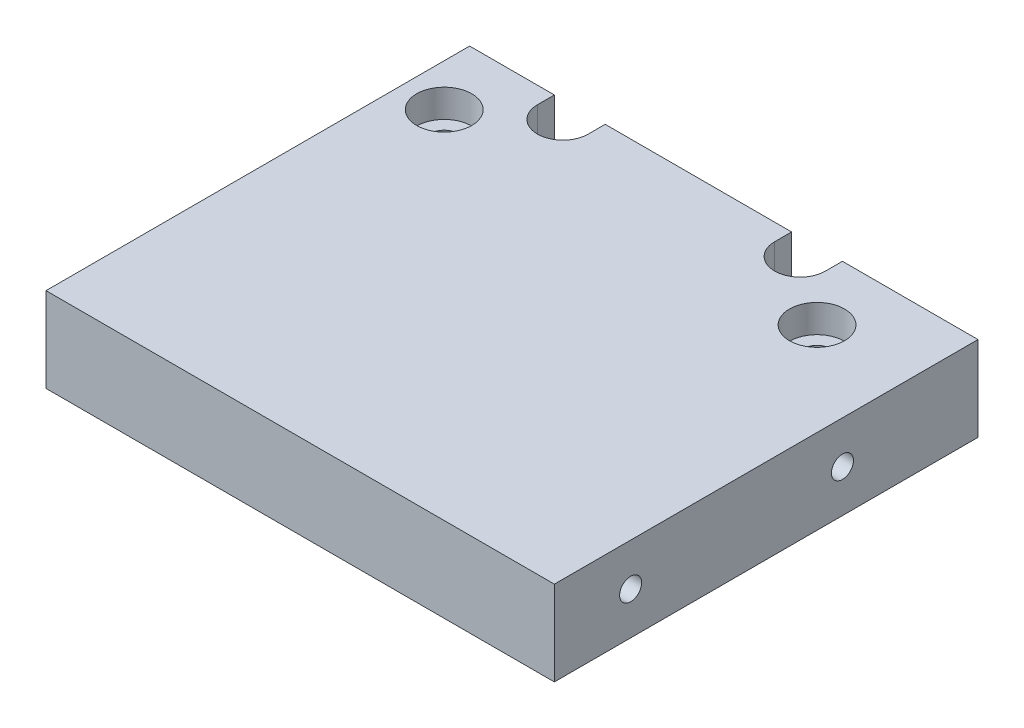
ISO-10303-21;
HEADER;
FILE_DESCRIPTION(('STEP AP214'),'2;1');
FILE_NAME('part.step','',(''),(''),'','','');
FILE_SCHEMA(('AUTOMOTIVE_DESIGN { 1 0 10303 214 1 1 1 1 }'));
ENDSEC;
DATA;
#1=APPLICATION_CONTEXT('core data for automotive mechanical design processes');
#2=APPLICATION_PROTOCOL_DEFINITION('international standard','automotive_design',2000,#1);
#3=PRODUCT_CONTEXT('',#1,'mechanical');
#4=PRODUCT('Part','Part','',(#3));
#5=PRODUCT_RELATED_PRODUCT_CATEGORY('part','',(#4));
#6=PRODUCT_DEFINITION_FORMATION('','',#4);
#7=PRODUCT_DEFINITION_CONTEXT('part definition',#1,'design');
#8=PRODUCT_DEFINITION('design','',#6,#7);
#9=PRODUCT_DEFINITION_SHAPE('','',#8);
#10=(LENGTH_UNIT() NAMED_UNIT(*) SI_UNIT(.MILLI.,.METRE.));
#11=(NAMED_UNIT(*) PLANE_ANGLE_UNIT() SI_UNIT($,.RADIAN.));
#12=(NAMED_UNIT(*) SI_UNIT($,.STERADIAN.) SOLID_ANGLE_UNIT());
#13=UNCERTAINTY_MEASURE_WITH_UNIT(LENGTH_MEASURE(1.E-05),#10,'distance_accuracy_value','');
#14=(GEOMETRIC_REPRESENTATION_CONTEXT(3) GLOBAL_UNCERTAINTY_ASSIGNED_CONTEXT((#13)) GLOBAL_UNIT_ASSIGNED_CONTEXT((#10,
#11,#12)) REPRESENTATION_CONTEXT('',''));
#15=CARTESIAN_POINT('',(0.,0.,0.));
#16=DIRECTION('',(0.,0.,1.));
#17=DIRECTION('',(1.,0.,0.));
#18=AXIS2_PLACEMENT_3D('',#15,#16,#17);
#19=CARTESIAN_POINT('',(0.,10.,0.));
#20=DIRECTION('',(0.,-1.,0.));
#21=DIRECTION('',(0.,0.,-1.));
#22=AXIS2_PLACEMENT_3D('',#19,#20,#21);
#23=PLANE('',#22);
#24=CARTESIAN_POINT('',(5.,10.,-42.));
#25=DIRECTION('',(0.,1.,0.));
#26=DIRECTION('',(0.,0.,1.));
#27=AXIS2_PLACEMENT_3D('',#24,#25,#26);
#28=CIRCLE('',#27,3.25);
#29=CARTESIAN_POINT('',(5.,10.,-38.75));
#30=VERTEX_POINT('',#29);
#31=EDGE_CURVE('E187',#30,#30,#28,.T.);
#32=ORIENTED_EDGE('',*,*,#31,.F.);
#33=EDGE_LOOP('',(#32));
#34=FACE_BOUND('',#33,.T.);
#35=DIRECTION('',(0.,0.,-1.));
#36=VECTOR('',#35,1.);
#37=CARTESIAN_POINT('',(60.,10.,0.));
#38=LINE('',#37,#36);
#39=CARTESIAN_POINT('',(60.,10.,0.));
#40=VERTEX_POINT('',#39);
#41=CARTESIAN_POINT('',(60.,10.,-50.));
#42=VERTEX_POINT('',#41);
#43=EDGE_CURVE('E274',#40,#42,#38,.T.);
#44=ORIENTED_EDGE('',*,*,#43,.T.);
#45=DIRECTION('',(1.,0.,0.));
#46=VECTOR('',#45,1.);
#47=CARTESIAN_POINT('',(0.,10.,-50.));
#48=LINE('',#47,#46);
#49=CARTESIAN_POINT('',(44.,10.,-50.));
#50=VERTEX_POINT('',#49);
#51=EDGE_CURVE('E269',#50,#42,#48,.T.);
#52=ORIENTED_EDGE('',*,*,#51,.F.);
#53=DIRECTION('',(0.,0.,-1.));
#54=VECTOR('',#53,1.);
#55=CARTESIAN_POINT('',(44.,10.,-48.));
#56=LINE('',#55,#54);
#57=CARTESIAN_POINT('',(44.,10.,-48.));
#58=VERTEX_POINT('',#57);
#59=EDGE_CURVE('E260',#58,#50,#56,.T.);
#60=ORIENTED_EDGE('',*,*,#59,.F.);
#61=CARTESIAN_POINT('',(41.,10.,-48.));
#62=DIRECTION('',(0.,1.,0.));
#63=DIRECTION('',(0.,0.,1.));
#64=AXIS2_PLACEMENT_3D('',#61,#62,#63);
#65=CIRCLE('',#64,3.);
#66=CARTESIAN_POINT('',(41.,10.,-45.));
#67=VERTEX_POINT('',#66);
#68=EDGE_CURVE('E263',#67,#58,#65,.T.);
#69=ORIENTED_EDGE('',*,*,#68,.F.);
#70=CARTESIAN_POINT('',(38.,10.,-48.));
#71=VERTEX_POINT('',#70);
#72=EDGE_CURVE('E264',#71,#67,#65,.T.);
#73=ORIENTED_EDGE('',*,*,#72,.F.);
#74=DIRECTION('',(0.,0.,1.));
#75=VECTOR('',#74,1.);
#76=CARTESIAN_POINT('',(38.,10.,-48.));
#77=LINE('',#76,#75);
#78=CARTESIAN_POINT('',(38.,10.,-50.));
#79=VERTEX_POINT('',#78);
#80=EDGE_CURVE('E252',#79,#71,#77,.T.);
#81=ORIENTED_EDGE('',*,*,#80,.F.);
#82=CARTESIAN_POINT('',(16.,10.,-50.));
#83=VERTEX_POINT('',#82);
#84=EDGE_CURVE('E275',#83,#79,#48,.T.);
#85=ORIENTED_EDGE('',*,*,#84,.F.);
#86=DIRECTION('',(0.,0.,-1.));
#87=VECTOR('',#86,1.);
#88=CARTESIAN_POINT('',(16.,10.,-48.));
#89=LINE('',#88,#87);
#90=CARTESIAN_POINT('',(16.,10.,-48.));
#91=VERTEX_POINT('',#90);
#92=EDGE_CURVE('E232',#91,#83,#89,.T.);
#93=ORIENTED_EDGE('',*,*,#92,.F.);
#94=CARTESIAN_POINT('',(13.,10.,-48.));
#95=DIRECTION('',(0.,1.,0.));
#96=DIRECTION('',(0.,0.,1.));
#97=AXIS2_PLACEMENT_3D('',#94,#95,#96);
#98=CIRCLE('',#97,2.99999999999999);
#99=CARTESIAN_POINT('',(13.,9.99999999999999,-45.));
#100=VERTEX_POINT('',#99);
#101=EDGE_CURVE('E233',#100,#91,#98,.T.);
#102=ORIENTED_EDGE('',*,*,#101,.F.);
#103=CARTESIAN_POINT('',(10.,10.,-48.));
#104=VERTEX_POINT('',#103);
#105=EDGE_CURVE('E229',#104,#100,#98,.T.);
#106=ORIENTED_EDGE('',*,*,#105,.F.);
#107=DIRECTION('',(0.,0.,1.));
#108=VECTOR('',#107,1.);
#109=CARTESIAN_POINT('',(10.,10.,-48.));
#110=LINE('',#109,#108);
#111=CARTESIAN_POINT('',(10.,10.,-49.9999999999998));
#112=VERTEX_POINT('',#111);
#113=EDGE_CURVE('E236',#112,#104,#110,.T.);
#114=ORIENTED_EDGE('',*,*,#113,.F.);
#115=CARTESIAN_POINT('',(0.,10.,-50.));
#116=VERTEX_POINT('',#115);
#117=EDGE_CURVE('E271',#116,#112,#48,.T.);
#118=ORIENTED_EDGE('',*,*,#117,.F.);
#119=DIRECTION('',(0.,0.,-1.));
#120=VECTOR('',#119,1.);
#121=CARTESIAN_POINT('',(0.,10.,0.));
#122=LINE('',#121,#120);
#123=CARTESIAN_POINT('',(0.,10.,0.));
#124=VERTEX_POINT('',#123);
#125=EDGE_CURVE('E267',#124,#116,#122,.T.);
#126=ORIENTED_EDGE('',*,*,#125,.F.);
#127=DIRECTION('',(1.,0.,0.));
#128=VECTOR('',#127,1.);
#129=CARTESIAN_POINT('',(0.,10.,0.));
#130=LINE('',#129,#128);
#131=EDGE_CURVE('E277',#124,#40,#130,.T.);
#132=ORIENTED_EDGE('',*,*,#131,.T.);
#133=EDGE_LOOP('',(#44,#52,#60,#69,#73,#81,#85,#93,#102,#106,#114,#118,#126,#132));
#134=FACE_BOUND('',#133,.T.);
#135=CARTESIAN_POINT('',(49.,10.,-42.));
#136=DIRECTION('',(0.,1.,0.));
#137=DIRECTION('',(0.,0.,1.));
#138=AXIS2_PLACEMENT_3D('',#135,#136,#137);
#139=CIRCLE('',#138,3.25);
#140=CARTESIAN_POINT('',(49.,10.,-38.75));
#141=VERTEX_POINT('',#140);
#142=EDGE_CURVE('E199',#141,#141,#139,.T.);
#143=ORIENTED_EDGE('',*,*,#142,.F.);
#144=EDGE_LOOP('',(#143));
#145=FACE_BOUND('',#144,.T.);
#146=ADVANCED_FACE('F47',(#34,#134,#145),#23,.F.);
#147=CARTESIAN_POINT('',(41.,0.,-48.));
#148=DIRECTION('',(0.,1.,0.));
#149=DIRECTION('',(0.,0.,1.));
#150=AXIS2_PLACEMENT_3D('',#147,#148,#149);
#151=CYLINDRICAL_SURFACE('',#150,3.);
#152=CARTESIAN_POINT('',(41.,7.,-48.));
#153=DIRECTION('',(0.,-0.707106781186548,0.707106781186547));
#154=DIRECTION('',(0.,0.707106781186547,0.707106781186548));
#155=AXIS2_PLACEMENT_3D('',#152,#153,#154);
#156=ELLIPSE('',#155,4.24264068711928,3.);
#157=CARTESIAN_POINT('',(44.,7.,-48.));
#158=VERTEX_POINT('',#157);
#159=EDGE_CURVE('E62',#67,#158,#156,.F.);
#160=ORIENTED_EDGE('',*,*,#159,.F.);
#161=ORIENTED_EDGE('',*,*,#68,.T.);
#162=DIRECTION('',(0.,1.,0.));
#163=VECTOR('',#162,1.);
#164=CARTESIAN_POINT('',(44.,0.,-48.));
#165=LINE('',#164,#163);
#166=EDGE_CURVE('E249',#158,#58,#165,.T.);
#167=ORIENTED_EDGE('',*,*,#166,.F.);
#168=EDGE_LOOP('',(#160,#161,#167));
#169=FACE_BOUND('',#168,.T.);
#170=ADVANCED_FACE('F349',(#169),#151,.F.);
#171=CARTESIAN_POINT('',(38.,7.,-48.));
#172=VERTEX_POINT('',#171);
#173=EDGE_CURVE('E226',#172,#67,#156,.F.);
#174=ORIENTED_EDGE('',*,*,#173,.F.);
#175=DIRECTION('',(0.,1.,0.));
#176=VECTOR('',#175,1.);
#177=CARTESIAN_POINT('',(38.,0.,-48.));
#178=LINE('',#177,#176);
#179=EDGE_CURVE('E228',#172,#71,#178,.T.);
#180=ORIENTED_EDGE('',*,*,#179,.T.);
#181=ORIENTED_EDGE('',*,*,#72,.T.);
#182=EDGE_LOOP('',(#174,#180,#181));
#183=FACE_BOUND('',#182,.T.);
#184=ADVANCED_FACE('F355',(#183),#151,.F.);
#185=CARTESIAN_POINT('',(38.,0.,-48.));
#186=DIRECTION('',(-1.,0.,0.));
#187=DIRECTION('',(0.,0.,1.));
#188=AXIS2_PLACEMENT_3D('',#185,#186,#187);
#189=PLANE('',#188);
#190=DIRECTION('',(0.,0.707106781186547,0.707106781186548));
#191=VECTOR('',#190,1.);
#192=CARTESIAN_POINT('',(38.,3.5,-51.5));
#193=LINE('',#192,#191);
#194=CARTESIAN_POINT('',(38.,5.,-50.));
#195=VERTEX_POINT('',#194);
#196=EDGE_CURVE('E70',#195,#172,#193,.T.);
#197=ORIENTED_EDGE('',*,*,#196,.F.);
#198=DIRECTION('',(0.,1.,0.));
#199=VECTOR('',#198,1.);
#200=CARTESIAN_POINT('',(38.,0.,-50.));
#201=LINE('',#200,#199);
#202=EDGE_CURVE('E255',#195,#79,#201,.T.);
#203=ORIENTED_EDGE('',*,*,#202,.T.);
#204=ORIENTED_EDGE('',*,*,#80,.T.);
#205=ORIENTED_EDGE('',*,*,#179,.F.);
#206=EDGE_LOOP('',(#197,#203,#204,#205));
#207=FACE_BOUND('',#206,.T.);
#208=ADVANCED_FACE('F360',(#207),#189,.F.);
#209=CARTESIAN_POINT('',(44.,0.,-48.));
#210=DIRECTION('',(1.,0.,0.));
#211=DIRECTION('',(0.,0.,-1.));
#212=AXIS2_PLACEMENT_3D('',#209,#210,#211);
#213=PLANE('',#212);
#214=DIRECTION('',(0.,-0.707106781186547,-0.707106781186548));
#215=VECTOR('',#214,1.);
#216=CARTESIAN_POINT('',(44.,3.5,-51.5));
#217=LINE('',#216,#215);
#218=CARTESIAN_POINT('',(44.,5.,-50.));
#219=VERTEX_POINT('',#218);
#220=EDGE_CURVE('E222',#158,#219,#217,.T.);
#221=ORIENTED_EDGE('',*,*,#220,.F.);
#222=ORIENTED_EDGE('',*,*,#166,.T.);
#223=ORIENTED_EDGE('',*,*,#59,.T.);
#224=DIRECTION('',(0.,1.,0.));
#225=VECTOR('',#224,1.);
#226=CARTESIAN_POINT('',(44.,0.,-50.));
#227=LINE('',#226,#225);
#228=EDGE_CURVE('E253',#219,#50,#227,.T.);
#229=ORIENTED_EDGE('',*,*,#228,.F.);
#230=EDGE_LOOP('',(#221,#222,#223,#229));
#231=FACE_BOUND('',#230,.T.);
#232=ADVANCED_FACE('F546',(#231),#213,.F.);
#233=CARTESIAN_POINT('',(13.,0.,-48.));
#234=DIRECTION('',(0.,1.,0.));
#235=DIRECTION('',(0.,0.,1.));
#236=AXIS2_PLACEMENT_3D('',#233,#234,#235);
#237=CYLINDRICAL_SURFACE('',#236,2.99999999999999);
#238=CARTESIAN_POINT('',(13.,7.,-48.));
#239=DIRECTION('',(0.,-0.707106781186548,0.707106781186547));
#240=DIRECTION('',(0.,0.707106781186547,0.707106781186548));
#241=AXIS2_PLACEMENT_3D('',#238,#239,#240);
#242=ELLIPSE('',#241,4.24264068711927,2.99999999999999);
#243=CARTESIAN_POINT('',(16.,7.00000000000005,-48.));
#244=VERTEX_POINT('',#243);
#245=EDGE_CURVE('E215',#100,#244,#242,.F.);
#246=ORIENTED_EDGE('',*,*,#245,.F.);
#247=ORIENTED_EDGE('',*,*,#101,.T.);
#248=DIRECTION('',(0.,1.,0.));
#249=VECTOR('',#248,1.);
#250=CARTESIAN_POINT('',(16.,0.,-48.));
#251=LINE('',#250,#249);
#252=EDGE_CURVE('E239',#244,#91,#251,.T.);
#253=ORIENTED_EDGE('',*,*,#252,.F.);
#254=EDGE_LOOP('',(#246,#247,#253));
#255=FACE_BOUND('',#254,.T.);
#256=ADVANCED_FACE('F332',(#255),#237,.F.);
#257=CARTESIAN_POINT('',(10.,7.,-48.));
#258=VERTEX_POINT('',#257);
#259=EDGE_CURVE('E218',#258,#100,#242,.F.);
#260=ORIENTED_EDGE('',*,*,#259,.F.);
#261=DIRECTION('',(0.,1.,0.));
#262=VECTOR('',#261,1.);
#263=CARTESIAN_POINT('',(10.,0.,-48.));
#264=LINE('',#263,#262);
#265=EDGE_CURVE('E240',#258,#104,#264,.T.);
#266=ORIENTED_EDGE('',*,*,#265,.T.);
#267=ORIENTED_EDGE('',*,*,#105,.T.);
#268=EDGE_LOOP('',(#260,#266,#267));
#269=FACE_BOUND('',#268,.T.);
#270=ADVANCED_FACE('F336',(#269),#237,.F.);
#271=CARTESIAN_POINT('',(10.,0.,-48.));
#272=DIRECTION('',(-1.,0.,0.));
#273=DIRECTION('',(0.,0.,1.));
#274=AXIS2_PLACEMENT_3D('',#271,#272,#273);
#275=PLANE('',#274);
#276=DIRECTION('',(0.,0.707106781186547,0.707106781186548));
#277=VECTOR('',#276,1.);
#278=CARTESIAN_POINT('',(10.,3.5,-51.5));
#279=LINE('',#278,#277);
#280=CARTESIAN_POINT('',(10.,5.00000000000022,-49.9999999999998));
#281=VERTEX_POINT('',#280);
#282=EDGE_CURVE('E219',#281,#258,#279,.T.);
#283=ORIENTED_EDGE('',*,*,#282,.F.);
#284=DIRECTION('',(0.,1.,0.));
#285=VECTOR('',#284,1.);
#286=CARTESIAN_POINT('',(10.,0.,-49.9999999999998));
#287=LINE('',#286,#285);
#288=EDGE_CURVE('E243',#281,#112,#287,.T.);
#289=ORIENTED_EDGE('',*,*,#288,.T.);
#290=ORIENTED_EDGE('',*,*,#113,.T.);
#291=ORIENTED_EDGE('',*,*,#265,.F.);
#292=EDGE_LOOP('',(#283,#289,#290,#291));
#293=FACE_BOUND('',#292,.T.);
#294=ADVANCED_FACE('F338',(#293),#275,.F.);
#295=CARTESIAN_POINT('',(16.,0.,-48.));
#296=DIRECTION('',(1.,0.,0.));
#297=DIRECTION('',(0.,0.,-1.));
#298=AXIS2_PLACEMENT_3D('',#295,#296,#297);
#299=PLANE('',#298);
#300=DIRECTION('',(0.,-0.707106781186547,-0.707106781186548));
#301=VECTOR('',#300,1.);
#302=CARTESIAN_POINT('',(16.,3.50000000000003,-51.5));
#303=LINE('',#302,#301);
#304=CARTESIAN_POINT('',(16.,5.,-50.));
#305=VERTEX_POINT('',#304);
#306=EDGE_CURVE('E11',#244,#305,#303,.T.);
#307=ORIENTED_EDGE('',*,*,#306,.F.);
#308=ORIENTED_EDGE('',*,*,#252,.T.);
#309=ORIENTED_EDGE('',*,*,#92,.T.);
#310=DIRECTION('',(0.,1.,0.));
#311=VECTOR('',#310,1.);
#312=CARTESIAN_POINT('',(16.,0.,-50.));
#313=LINE('',#312,#311);
#314=EDGE_CURVE('E245',#305,#83,#313,.T.);
#315=ORIENTED_EDGE('',*,*,#314,.F.);
#316=EDGE_LOOP('',(#307,#308,#309,#315));
#317=FACE_BOUND('',#316,.T.);
#318=ADVANCED_FACE('F329',(#317),#299,.F.);
#319=CARTESIAN_POINT('',(0.,10.,0.));
#320=DIRECTION('',(-1.,0.,0.));
#321=DIRECTION('',(0.,0.,1.));
#322=AXIS2_PLACEMENT_3D('',#319,#320,#321);
#323=PLANE('',#322);
#324=CARTESIAN_POINT('',(0.,5.,-34.));
#325=DIRECTION('',(-1.,0.,0.));
#326=DIRECTION('',(0.,0.,1.));
#327=AXIS2_PLACEMENT_3D('',#324,#325,#326);
#328=CIRCLE('',#327,1.3);
#329=CARTESIAN_POINT('',(0.,5.,-32.7));
#330=VERTEX_POINT('',#329);
#331=EDGE_CURVE('E165',#330,#330,#328,.T.);
#332=ORIENTED_EDGE('',*,*,#331,.F.);
#333=EDGE_LOOP('',(#332));
#334=FACE_BOUND('',#333,.T.);
#335=CARTESIAN_POINT('',(0.,5.,-9.));
#336=DIRECTION('',(-1.,0.,0.));
#337=DIRECTION('',(0.,0.,1.));
#338=AXIS2_PLACEMENT_3D('',#335,#336,#337);
#339=CIRCLE('',#338,1.3);
#340=CARTESIAN_POINT('',(0.,5.,-7.7));
#341=VERTEX_POINT('',#340);
#342=EDGE_CURVE('E164',#341,#341,#339,.T.);
#343=ORIENTED_EDGE('',*,*,#342,.F.);
#344=EDGE_LOOP('',(#343));
#345=FACE_BOUND('',#344,.T.);
#346=DIRECTION('',(0.,-1.,0.));
#347=VECTOR('',#346,1.);
#348=CARTESIAN_POINT('',(0.,10.,-50.));
#349=LINE('',#348,#347);
#350=CARTESIAN_POINT('',(0.,0.,-50.));
#351=VERTEX_POINT('',#350);
#352=EDGE_CURVE('E279',#116,#351,#349,.T.);
#353=ORIENTED_EDGE('',*,*,#352,.T.);
#354=DIRECTION('',(0.,0.,-1.));
#355=VECTOR('',#354,1.);
#356=CARTESIAN_POINT('',(0.,0.,0.));
#357=LINE('',#356,#355);
#358=CARTESIAN_POINT('',(0.,0.,0.));
#359=VERTEX_POINT('',#358);
#360=EDGE_CURVE('E242',#359,#351,#357,.T.);
#361=ORIENTED_EDGE('',*,*,#360,.F.);
#362=DIRECTION('',(0.,-1.,0.));
#363=VECTOR('',#362,1.);
#364=CARTESIAN_POINT('',(0.,10.,0.));
#365=LINE('',#364,#363);
#366=EDGE_CURVE('E55',#124,#359,#365,.T.);
#367=ORIENTED_EDGE('',*,*,#366,.F.);
#368=ORIENTED_EDGE('',*,*,#125,.T.);
#369=EDGE_LOOP('',(#353,#361,#367,#368));
#370=FACE_BOUND('',#369,.T.);
#371=ADVANCED_FACE('F49',(#334,#345,#370),#323,.T.);
#372=CARTESIAN_POINT('',(0.,10.,0.));
#373=DIRECTION('',(0.,0.,-1.));
#374=DIRECTION('',(-1.,0.,0.));
#375=AXIS2_PLACEMENT_3D('',#372,#373,#374);
#376=PLANE('',#375);
#377=DIRECTION('',(1.,0.,0.));
#378=VECTOR('',#377,1.);
#379=CARTESIAN_POINT('',(0.,0.,0.));
#380=LINE('',#379,#378);
#381=CARTESIAN_POINT('',(60.,0.,0.));
#382=VERTEX_POINT('',#381);
#383=EDGE_CURVE('E270',#359,#382,#380,.T.);
#384=ORIENTED_EDGE('',*,*,#383,.T.);
#385=DIRECTION('',(0.,-1.,0.));
#386=VECTOR('',#385,1.);
#387=CARTESIAN_POINT('',(60.,10.,0.));
#388=LINE('',#387,#386);
#389=EDGE_CURVE('E290',#40,#382,#388,.T.);
#390=ORIENTED_EDGE('',*,*,#389,.F.);
#391=ORIENTED_EDGE('',*,*,#131,.F.);
#392=ORIENTED_EDGE('',*,*,#366,.T.);
#393=EDGE_LOOP('',(#384,#390,#391,#392));
#394=FACE_BOUND('',#393,.T.);
#395=ADVANCED_FACE('F316',(#394),#376,.F.);
#396=CARTESIAN_POINT('',(60.,10.,0.));
#397=DIRECTION('',(-1.,0.,0.));
#398=DIRECTION('',(0.,0.,1.));
#399=AXIS2_PLACEMENT_3D('',#396,#397,#398);
#400=PLANE('',#399);
#401=CARTESIAN_POINT('',(60.,5.,-34.));
#402=DIRECTION('',(1.,0.,0.));
#403=DIRECTION('',(0.,0.,-1.));
#404=AXIS2_PLACEMENT_3D('',#401,#402,#403);
#405=CIRCLE('',#404,1.3);
#406=CARTESIAN_POINT('',(60.,5.,-35.3));
#407=VERTEX_POINT('',#406);
#408=EDGE_CURVE('E175',#407,#407,#405,.T.);
#409=ORIENTED_EDGE('',*,*,#408,.F.);
#410=EDGE_LOOP('',(#409));
#411=FACE_BOUND('',#410,.T.);
#412=CARTESIAN_POINT('',(60.,5.,-9.));
#413=DIRECTION('',(1.,0.,0.));
#414=DIRECTION('',(0.,0.,-1.));
#415=AXIS2_PLACEMENT_3D('',#412,#413,#414);
#416=CIRCLE('',#415,1.3);
#417=CARTESIAN_POINT('',(60.,5.,-10.3));
#418=VERTEX_POINT('',#417);
#419=EDGE_CURVE('E181',#418,#418,#416,.T.);
#420=ORIENTED_EDGE('',*,*,#419,.F.);
#421=EDGE_LOOP('',(#420));
#422=FACE_BOUND('',#421,.T.);
#423=DIRECTION('',(0.,0.,-1.));
#424=VECTOR('',#423,1.);
#425=CARTESIAN_POINT('',(60.,0.,0.));
#426=LINE('',#425,#424);
#427=CARTESIAN_POINT('',(60.,0.,-50.));
#428=VERTEX_POINT('',#427);
#429=EDGE_CURVE('E285',#382,#428,#426,.T.);
#430=ORIENTED_EDGE('',*,*,#429,.T.);
#431=DIRECTION('',(0.,-1.,0.));
#432=VECTOR('',#431,1.);
#433=CARTESIAN_POINT('',(60.,10.,-50.));
#434=LINE('',#433,#432);
#435=EDGE_CURVE('E293',#42,#428,#434,.T.);
#436=ORIENTED_EDGE('',*,*,#435,.F.);
#437=ORIENTED_EDGE('',*,*,#43,.F.);
#438=ORIENTED_EDGE('',*,*,#389,.T.);
#439=EDGE_LOOP('',(#430,#436,#437,#438));
#440=FACE_BOUND('',#439,.T.);
#441=ADVANCED_FACE('F312',(#411,#422,#440),#400,.F.);
#442=CARTESIAN_POINT('',(0.,10.,-50.));
#443=DIRECTION('',(0.,0.,-1.));
#444=DIRECTION('',(-1.,0.,0.));
#445=AXIS2_PLACEMENT_3D('',#442,#443,#444);
#446=PLANE('',#445);
#447=DIRECTION('',(-1.,0.,0.));
#448=VECTOR('',#447,1.);
#449=CARTESIAN_POINT('',(60.,5.,-50.));
#450=LINE('',#449,#448);
#451=EDGE_CURVE('E214',#219,#195,#450,.T.);
#452=ORIENTED_EDGE('',*,*,#451,.F.);
#453=ORIENTED_EDGE('',*,*,#228,.T.);
#454=ORIENTED_EDGE('',*,*,#51,.T.);
#455=ORIENTED_EDGE('',*,*,#435,.T.);
#456=DIRECTION('',(1.,0.,0.));
#457=VECTOR('',#456,1.);
#458=CARTESIAN_POINT('',(0.,0.,-50.));
#459=LINE('',#458,#457);
#460=EDGE_CURVE('E282',#351,#428,#459,.T.);
#461=ORIENTED_EDGE('',*,*,#460,.F.);
#462=ORIENTED_EDGE('',*,*,#352,.F.);
#463=ORIENTED_EDGE('',*,*,#117,.T.);
#464=ORIENTED_EDGE('',*,*,#288,.F.);
#465=EDGE_CURVE('E211',#305,#281,#450,.T.);
#466=ORIENTED_EDGE('',*,*,#465,.F.);
#467=ORIENTED_EDGE('',*,*,#314,.T.);
#468=ORIENTED_EDGE('',*,*,#84,.T.);
#469=ORIENTED_EDGE('',*,*,#202,.F.);
#470=EDGE_LOOP('',(#452,#453,#454,#455,#461,#462,#463,#464,#466,#467,#468,#469));
#471=FACE_BOUND('',#470,.T.);
#472=ADVANCED_FACE('F306',(#471),#446,.T.);
#473=CARTESIAN_POINT('',(0.,0.,0.));
#474=DIRECTION('',(0.,-1.,0.));
#475=DIRECTION('',(0.,0.,-1.));
#476=AXIS2_PLACEMENT_3D('',#473,#474,#475);
#477=PLANE('',#476);
#478=CARTESIAN_POINT('',(5.,0.,-42.));
#479=DIRECTION('',(0.,1.,0.));
#480=DIRECTION('',(0.,0.,1.));
#481=AXIS2_PLACEMENT_3D('',#478,#479,#480);
#482=CIRCLE('',#481,1.7);
#483=CARTESIAN_POINT('',(5.,0.,-40.3));
#484=VERTEX_POINT('',#483);
#485=EDGE_CURVE('E196',#484,#484,#482,.T.);
#486=ORIENTED_EDGE('',*,*,#485,.T.);
#487=EDGE_LOOP('',(#486));
#488=FACE_BOUND('',#487,.T.);
#489=CARTESIAN_POINT('',(49.,0.,-42.));
#490=DIRECTION('',(0.,1.,0.));
#491=DIRECTION('',(0.,0.,1.));
#492=AXIS2_PLACEMENT_3D('',#489,#490,#491);
#493=CIRCLE('',#492,1.7);
#494=CARTESIAN_POINT('',(49.,0.,-40.3));
#495=VERTEX_POINT('',#494);
#496=EDGE_CURVE('E208',#495,#495,#493,.T.);
#497=ORIENTED_EDGE('',*,*,#496,.T.);
#498=EDGE_LOOP('',(#497));
#499=FACE_BOUND('',#498,.T.);
#500=ORIENTED_EDGE('',*,*,#460,.T.);
#501=ORIENTED_EDGE('',*,*,#429,.F.);
#502=ORIENTED_EDGE('',*,*,#383,.F.);
#503=ORIENTED_EDGE('',*,*,#360,.T.);
#504=EDGE_LOOP('',(#500,#501,#502,#503));
#505=FACE_BOUND('',#504,.T.);
#506=ADVANCED_FACE('F303',(#488,#499,#505),#477,.T.);
#507=CARTESIAN_POINT('',(60.,10.,-45.));
#508=DIRECTION('',(0.,-0.707106781186548,0.707106781186547));
#509=DIRECTION('',(0.,-0.707106781186547,-0.707106781186548));
#510=AXIS2_PLACEMENT_3D('',#507,#508,#509);
#511=PLANE('',#510);
#512=ORIENTED_EDGE('',*,*,#465,.T.);
#513=ORIENTED_EDGE('',*,*,#282,.T.);
#514=ORIENTED_EDGE('',*,*,#259,.T.);
#515=ORIENTED_EDGE('',*,*,#245,.T.);
#516=ORIENTED_EDGE('',*,*,#306,.T.);
#517=EDGE_LOOP('',(#512,#513,#514,#515,#516));
#518=FACE_BOUND('',#517,.T.);
#519=ADVANCED_FACE('F325',(#518),#511,.F.);
#520=ORIENTED_EDGE('',*,*,#451,.T.);
#521=ORIENTED_EDGE('',*,*,#196,.T.);
#522=ORIENTED_EDGE('',*,*,#173,.T.);
#523=ORIENTED_EDGE('',*,*,#159,.T.);
#524=ORIENTED_EDGE('',*,*,#220,.T.);
#525=EDGE_LOOP('',(#520,#521,#522,#523,#524));
#526=FACE_BOUND('',#525,.T.);
#527=ADVANCED_FACE('F386',(#526),#511,.F.);
#528=CARTESIAN_POINT('',(49.,10.,-42.));
#529=DIRECTION('',(0.,1.,0.));
#530=DIRECTION('',(0.,0.,1.));
#531=AXIS2_PLACEMENT_3D('',#528,#529,#530);
#532=CYLINDRICAL_SURFACE('',#531,1.7);
#533=ORIENTED_EDGE('',*,*,#496,.F.);
#534=EDGE_LOOP('',(#533));
#535=FACE_BOUND('',#534,.T.);
#536=CARTESIAN_POINT('',(49.,6.7,-42.));
#537=DIRECTION('',(0.,1.,0.));
#538=DIRECTION('',(0.,0.,1.));
#539=AXIS2_PLACEMENT_3D('',#536,#537,#538);
#540=CIRCLE('',#539,1.7);
#541=CARTESIAN_POINT('',(49.,6.7,-40.3));
#542=VERTEX_POINT('',#541);
#543=EDGE_CURVE('E205',#542,#542,#540,.T.);
#544=ORIENTED_EDGE('',*,*,#543,.T.);
#545=EDGE_LOOP('',(#544));
#546=FACE_BOUND('',#545,.T.);
#547=ADVANCED_FACE('F392',(#535,#546),#532,.F.);
#548=CARTESIAN_POINT('',(50.7,6.7,-42.));
#549=DIRECTION('',(0.,-1.,0.));
#550=DIRECTION('',(0.,0.,-1.));
#551=AXIS2_PLACEMENT_3D('',#548,#549,#550);
#552=PLANE('',#551);
#553=ORIENTED_EDGE('',*,*,#543,.F.);
#554=EDGE_LOOP('',(#553));
#555=FACE_BOUND('',#554,.T.);
#556=CARTESIAN_POINT('',(49.,6.7,-42.));
#557=DIRECTION('',(0.,1.,0.));
#558=DIRECTION('',(0.,0.,1.));
#559=AXIS2_PLACEMENT_3D('',#556,#557,#558);
#560=CIRCLE('',#559,3.25);
#561=CARTESIAN_POINT('',(49.,6.7,-38.75));
#562=VERTEX_POINT('',#561);
#563=EDGE_CURVE('E202',#562,#562,#560,.T.);
#564=ORIENTED_EDGE('',*,*,#563,.T.);
#565=EDGE_LOOP('',(#564));
#566=FACE_BOUND('',#565,.T.);
#567=ADVANCED_FACE('F398',(#555,#566),#552,.F.);
#568=CARTESIAN_POINT('',(49.,10.,-42.));
#569=DIRECTION('',(0.,1.,0.));
#570=DIRECTION('',(0.,0.,1.));
#571=AXIS2_PLACEMENT_3D('',#568,#569,#570);
#572=CYLINDRICAL_SURFACE('',#571,3.25);
#573=ORIENTED_EDGE('',*,*,#563,.F.);
#574=EDGE_LOOP('',(#573));
#575=FACE_BOUND('',#574,.T.);
#576=ORIENTED_EDGE('',*,*,#142,.T.);
#577=EDGE_LOOP('',(#576));
#578=FACE_BOUND('',#577,.T.);
#579=ADVANCED_FACE('F406',(#575,#578),#572,.F.);
#580=CARTESIAN_POINT('',(5.,10.,-42.));
#581=DIRECTION('',(0.,1.,0.));
#582=DIRECTION('',(0.,0.,1.));
#583=AXIS2_PLACEMENT_3D('',#580,#581,#582);
#584=CYLINDRICAL_SURFACE('',#583,1.7);
#585=ORIENTED_EDGE('',*,*,#485,.F.);
#586=EDGE_LOOP('',(#585));
#587=FACE_BOUND('',#586,.T.);
#588=CARTESIAN_POINT('',(5.,6.7,-42.));
#589=DIRECTION('',(0.,1.,0.));
#590=DIRECTION('',(0.,0.,1.));
#591=AXIS2_PLACEMENT_3D('',#588,#589,#590);
#592=CIRCLE('',#591,1.7);
#593=CARTESIAN_POINT('',(5.,6.7,-40.3));
#594=VERTEX_POINT('',#593);
#595=EDGE_CURVE('E193',#594,#594,#592,.T.);
#596=ORIENTED_EDGE('',*,*,#595,.T.);
#597=EDGE_LOOP('',(#596));
#598=FACE_BOUND('',#597,.T.);
#599=ADVANCED_FACE('F414',(#587,#598),#584,.F.);
#600=CARTESIAN_POINT('',(6.7,6.7,-42.));
#601=DIRECTION('',(0.,-1.,0.));
#602=DIRECTION('',(0.,0.,-1.));
#603=AXIS2_PLACEMENT_3D('',#600,#601,#602);
#604=PLANE('',#603);
#605=ORIENTED_EDGE('',*,*,#595,.F.);
#606=EDGE_LOOP('',(#605));
#607=FACE_BOUND('',#606,.T.);
#608=CARTESIAN_POINT('',(5.,6.7,-42.));
#609=DIRECTION('',(0.,1.,0.));
#610=DIRECTION('',(0.,0.,1.));
#611=AXIS2_PLACEMENT_3D('',#608,#609,#610);
#612=CIRCLE('',#611,3.25);
#613=CARTESIAN_POINT('',(5.,6.7,-38.75));
#614=VERTEX_POINT('',#613);
#615=EDGE_CURVE('E190',#614,#614,#612,.T.);
#616=ORIENTED_EDGE('',*,*,#615,.T.);
#617=EDGE_LOOP('',(#616));
#618=FACE_BOUND('',#617,.T.);
#619=ADVANCED_FACE('F422',(#607,#618),#604,.F.);
#620=CARTESIAN_POINT('',(5.,10.,-42.));
#621=DIRECTION('',(0.,1.,0.));
#622=DIRECTION('',(0.,0.,1.));
#623=AXIS2_PLACEMENT_3D('',#620,#621,#622);
#624=CYLINDRICAL_SURFACE('',#623,3.25);
#625=ORIENTED_EDGE('',*,*,#615,.F.);
#626=EDGE_LOOP('',(#625));
#627=FACE_BOUND('',#626,.T.);
#628=ORIENTED_EDGE('',*,*,#31,.T.);
#629=EDGE_LOOP('',(#628));
#630=FACE_BOUND('',#629,.T.);
#631=ADVANCED_FACE('F430',(#627,#630),#624,.F.);
#632=CARTESIAN_POINT('',(51.,5.,-9.));
#633=DIRECTION('',(1.,0.,0.));
#634=DIRECTION('',(0.,0.,-1.));
#635=AXIS2_PLACEMENT_3D('',#632,#633,#634);
#636=CONICAL_SURFACE('',#635,1.3,1.02974425867665);
#637=CARTESIAN_POINT('',(50.2188811952642,5.,-9.));
#638=VERTEX_POINT('',#637);
#639=VERTEX_LOOP('',#638);
#640=FACE_BOUND('',#639,.T.);
#641=CARTESIAN_POINT('',(51.,5.,-9.));
#642=DIRECTION('',(1.,0.,0.));
#643=DIRECTION('',(0.,0.,-1.));
#644=AXIS2_PLACEMENT_3D('',#641,#642,#643);
#645=CIRCLE('',#644,1.3);
#646=CARTESIAN_POINT('',(51.,5.,-10.3));
#647=VERTEX_POINT('',#646);
#648=EDGE_CURVE('E184',#647,#647,#645,.T.);
#649=ORIENTED_EDGE('',*,*,#648,.T.);
#650=EDGE_LOOP('',(#649));
#651=FACE_BOUND('',#650,.T.);
#652=ADVANCED_FACE('F438',(#640,#651),#636,.F.);
#653=CARTESIAN_POINT('',(60.,5.,-9.));
#654=DIRECTION('',(1.,0.,0.));
#655=DIRECTION('',(0.,0.,-1.));
#656=AXIS2_PLACEMENT_3D('',#653,#654,#655);
#657=CYLINDRICAL_SURFACE('',#656,1.3);
#658=ORIENTED_EDGE('',*,*,#648,.F.);
#659=EDGE_LOOP('',(#658));
#660=FACE_BOUND('',#659,.T.);
#661=ORIENTED_EDGE('',*,*,#419,.T.);
#662=EDGE_LOOP('',(#661));
#663=FACE_BOUND('',#662,.T.);
#664=ADVANCED_FACE('F447',(#660,#663),#657,.F.);
#665=CARTESIAN_POINT('',(51.,5.,-34.));
#666=DIRECTION('',(1.,0.,0.));
#667=DIRECTION('',(0.,0.,-1.));
#668=AXIS2_PLACEMENT_3D('',#665,#666,#667);
#669=CONICAL_SURFACE('',#668,1.3,1.02974425867665);
#670=CARTESIAN_POINT('',(50.2188811952642,5.,-34.));
#671=VERTEX_POINT('',#670);
#672=VERTEX_LOOP('',#671);
#673=FACE_BOUND('',#672,.T.);
#674=CARTESIAN_POINT('',(51.,5.,-34.));
#675=DIRECTION('',(1.,0.,0.));
#676=DIRECTION('',(0.,0.,-1.));
#677=AXIS2_PLACEMENT_3D('',#674,#675,#676);
#678=CIRCLE('',#677,1.3);
#679=CARTESIAN_POINT('',(51.,5.,-35.3));
#680=VERTEX_POINT('',#679);
#681=EDGE_CURVE('E178',#680,#680,#678,.T.);
#682=ORIENTED_EDGE('',*,*,#681,.T.);
#683=EDGE_LOOP('',(#682));
#684=FACE_BOUND('',#683,.T.);
#685=ADVANCED_FACE('F456',(#673,#684),#669,.F.);
#686=CARTESIAN_POINT('',(60.,5.,-34.));
#687=DIRECTION('',(1.,0.,0.));
#688=DIRECTION('',(0.,0.,-1.));
#689=AXIS2_PLACEMENT_3D('',#686,#687,#688);
#690=CYLINDRICAL_SURFACE('',#689,1.3);
#691=ORIENTED_EDGE('',*,*,#681,.F.);
#692=EDGE_LOOP('',(#691));
#693=FACE_BOUND('',#692,.T.);
#694=ORIENTED_EDGE('',*,*,#408,.T.);
#695=EDGE_LOOP('',(#694));
#696=FACE_BOUND('',#695,.T.);
#697=ADVANCED_FACE('F465',(#693,#696),#690,.F.);
#698=CARTESIAN_POINT('',(9.,5.,-9.));
#699=DIRECTION('',(-1.,0.,0.));
#700=DIRECTION('',(0.,0.,1.));
#701=AXIS2_PLACEMENT_3D('',#698,#699,#700);
#702=CONICAL_SURFACE('',#701,1.3,1.02974425867665);
#703=CARTESIAN_POINT('',(9.78111880473583,5.,-9.));
#704=VERTEX_POINT('',#703);
#705=VERTEX_LOOP('',#704);
#706=FACE_BOUND('',#705,.T.);
#707=CARTESIAN_POINT('',(9.,5.,-9.));
#708=DIRECTION('',(-1.,0.,0.));
#709=DIRECTION('',(0.,0.,1.));
#710=AXIS2_PLACEMENT_3D('',#707,#708,#709);
#711=CIRCLE('',#710,1.3);
#712=CARTESIAN_POINT('',(9.,5.,-7.7));
#713=VERTEX_POINT('',#712);
#714=EDGE_CURVE('E168',#713,#713,#711,.T.);
#715=ORIENTED_EDGE('',*,*,#714,.T.);
#716=EDGE_LOOP('',(#715));
#717=FACE_BOUND('',#716,.T.);
#718=ADVANCED_FACE('F473',(#706,#717),#702,.F.);
#719=CARTESIAN_POINT('',(0.,5.,-9.));
#720=DIRECTION('',(-1.,0.,0.));
#721=DIRECTION('',(0.,0.,1.));
#722=AXIS2_PLACEMENT_3D('',#719,#720,#721);
#723=CYLINDRICAL_SURFACE('',#722,1.3);
#724=ORIENTED_EDGE('',*,*,#714,.F.);
#725=EDGE_LOOP('',(#724));
#726=FACE_BOUND('',#725,.T.);
#727=ORIENTED_EDGE('',*,*,#342,.T.);
#728=EDGE_LOOP('',(#727));
#729=FACE_BOUND('',#728,.T.);
#730=ADVANCED_FACE('F158',(#726,#729),#723,.F.);
#731=CARTESIAN_POINT('',(9.,5.,-34.));
#732=DIRECTION('',(-1.,0.,0.));
#733=DIRECTION('',(0.,0.,1.));
#734=AXIS2_PLACEMENT_3D('',#731,#732,#733);
#735=CONICAL_SURFACE('',#734,1.3,1.02974425867665);
#736=CARTESIAN_POINT('',(9.78111880473583,5.,-34.));
#737=VERTEX_POINT('',#736);
#738=VERTEX_LOOP('',#737);
#739=FACE_BOUND('',#738,.T.);
#740=CARTESIAN_POINT('',(9.,5.,-34.));
#741=DIRECTION('',(-1.,0.,0.));
#742=DIRECTION('',(0.,0.,1.));
#743=AXIS2_PLACEMENT_3D('',#740,#741,#742);
#744=CIRCLE('',#743,1.3);
#745=CARTESIAN_POINT('',(9.,5.,-32.7));
#746=VERTEX_POINT('',#745);
#747=EDGE_CURVE('E162',#746,#746,#744,.T.);
#748=ORIENTED_EDGE('',*,*,#747,.T.);
#749=EDGE_LOOP('',(#748));
#750=FACE_BOUND('',#749,.T.);
#751=ADVANCED_FACE('F154',(#739,#750),#735,.F.);
#752=CARTESIAN_POINT('',(0.,5.,-34.));
#753=DIRECTION('',(-1.,0.,0.));
#754=DIRECTION('',(0.,0.,1.));
#755=AXIS2_PLACEMENT_3D('',#752,#753,#754);
#756=CYLINDRICAL_SURFACE('',#755,1.3);
#757=ORIENTED_EDGE('',*,*,#747,.F.);
#758=EDGE_LOOP('',(#757));
#759=FACE_BOUND('',#758,.T.);
#760=ORIENTED_EDGE('',*,*,#331,.T.);
#761=EDGE_LOOP('',(#760));
#762=FACE_BOUND('',#761,.T.);
#763=ADVANCED_FACE('F157',(#759,#762),#756,.F.);
#764=CLOSED_SHELL('',(#146,#170,#184,#208,#232,#256,#270,#294,#318,#371,#395,#441,#472,#506,
#519,#527,#547,#567,#579,#599,#619,#631,#652,#664,#685,#697,#718,#730,#751,#763));
#765=MANIFOLD_SOLID_BREP('B2',#764);
#766=ADVANCED_BREP_SHAPE_REPRESENTATION('',(#18,#765),#14);
#767=SHAPE_DEFINITION_REPRESENTATION(#9,#766);
ENDSEC;
END-ISO-10303-21;
